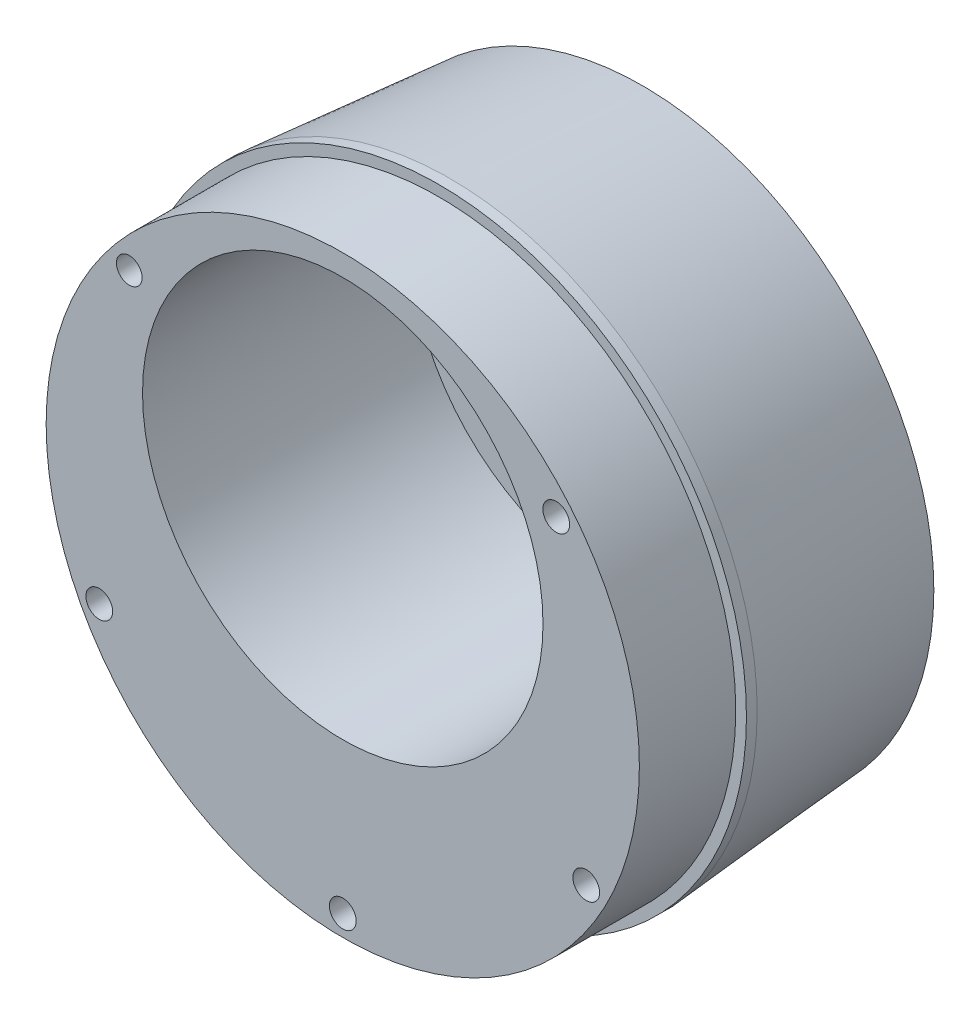
ISO-10303-21;
HEADER;
FILE_DESCRIPTION(('STEP AP214'),'2;1');
FILE_NAME('part.step','',(''),(''),'','','');
FILE_SCHEMA(('AUTOMOTIVE_DESIGN { 1 0 10303 214 1 1 1 1 }'));
ENDSEC;
DATA;
#1=APPLICATION_CONTEXT('core data for automotive mechanical design processes');
#2=APPLICATION_PROTOCOL_DEFINITION('international standard','automotive_design',2000,#1);
#3=PRODUCT_CONTEXT('',#1,'mechanical');
#4=PRODUCT('Part','Part','',(#3));
#5=PRODUCT_RELATED_PRODUCT_CATEGORY('part','',(#4));
#6=PRODUCT_DEFINITION_FORMATION('','',#4);
#7=PRODUCT_DEFINITION_CONTEXT('part definition',#1,'design');
#8=PRODUCT_DEFINITION('design','',#6,#7);
#9=PRODUCT_DEFINITION_SHAPE('','',#8);
#10=(LENGTH_UNIT() NAMED_UNIT(*) SI_UNIT(.MILLI.,.METRE.));
#11=(NAMED_UNIT(*) PLANE_ANGLE_UNIT() SI_UNIT($,.RADIAN.));
#12=(NAMED_UNIT(*) SI_UNIT($,.STERADIAN.) SOLID_ANGLE_UNIT());
#13=UNCERTAINTY_MEASURE_WITH_UNIT(LENGTH_MEASURE(1.E-05),#10,'distance_accuracy_value','');
#14=(GEOMETRIC_REPRESENTATION_CONTEXT(3) GLOBAL_UNCERTAINTY_ASSIGNED_CONTEXT((#13)) GLOBAL_UNIT_ASSIGNED_CONTEXT((#10,
#11,#12)) REPRESENTATION_CONTEXT('',''));
#15=CARTESIAN_POINT('',(0.,0.,0.));
#16=DIRECTION('',(0.,0.,1.));
#17=DIRECTION('',(1.,0.,0.));
#18=AXIS2_PLACEMENT_3D('',#15,#16,#17);
#19=CARTESIAN_POINT('',(15.5,7.,28.));
#20=DIRECTION('',(0.,0.,-1.));
#21=DIRECTION('',(-1.,0.,0.));
#22=AXIS2_PLACEMENT_3D('',#19,#20,#21);
#23=CYLINDRICAL_SURFACE('',#22,1.65);
#24=CARTESIAN_POINT('',(15.5,7.,2.00000000000003));
#25=DIRECTION('',(0.,0.,-1.));
#26=DIRECTION('',(-1.,0.,0.));
#27=AXIS2_PLACEMENT_3D('',#24,#25,#26);
#28=CIRCLE('',#27,1.65);
#29=CARTESIAN_POINT('',(13.85,7.,2.00000000000003));
#30=VERTEX_POINT('',#29);
#31=EDGE_CURVE('E85',#30,#30,#28,.T.);
#32=ORIENTED_EDGE('',*,*,#31,.T.);
#33=EDGE_LOOP('',(#32));
#34=FACE_BOUND('',#33,.T.);
#35=CARTESIAN_POINT('',(15.5,7.,3.));
#36=DIRECTION('',(0.,0.,1.));
#37=DIRECTION('',(1.,0.,0.));
#38=AXIS2_PLACEMENT_3D('',#35,#36,#37);
#39=CIRCLE('',#38,1.65);
#40=CARTESIAN_POINT('',(17.15,7.,3.));
#41=VERTEX_POINT('',#40);
#42=EDGE_CURVE('E99',#41,#41,#39,.T.);
#43=ORIENTED_EDGE('',*,*,#42,.T.);
#44=EDGE_LOOP('',(#43));
#45=FACE_BOUND('',#44,.T.);
#46=ADVANCED_FACE('F38',(#34,#45),#23,.F.);
#47=CARTESIAN_POINT('',(7.74999999999997,-6.42339375865882,28.));
#48=DIRECTION('',(0.,0.,-1.));
#49=DIRECTION('',(-1.,0.,0.));
#50=AXIS2_PLACEMENT_3D('',#47,#48,#49);
#51=CYLINDRICAL_SURFACE('',#50,1.65);
#52=CARTESIAN_POINT('',(7.74999999999997,-6.42339375865882,2.00000000000003));
#53=DIRECTION('',(0.,0.,-1.));
#54=DIRECTION('',(-1.,0.,0.));
#55=AXIS2_PLACEMENT_3D('',#52,#53,#54);
#56=CIRCLE('',#55,1.65);
#57=CARTESIAN_POINT('',(6.09999999999997,-6.42339375865882,2.00000000000003));
#58=VERTEX_POINT('',#57);
#59=EDGE_CURVE('E82',#58,#58,#56,.T.);
#60=ORIENTED_EDGE('',*,*,#59,.T.);
#61=EDGE_LOOP('',(#60));
#62=FACE_BOUND('',#61,.T.);
#63=CARTESIAN_POINT('',(7.74999999999997,-6.42339375865882,3.));
#64=DIRECTION('',(0.,0.,1.));
#65=DIRECTION('',(1.,0.,0.));
#66=AXIS2_PLACEMENT_3D('',#63,#64,#65);
#67=CIRCLE('',#66,1.65);
#68=CARTESIAN_POINT('',(9.39999999999996,-6.42339375865882,3.));
#69=VERTEX_POINT('',#68);
#70=EDGE_CURVE('E102',#69,#69,#67,.T.);
#71=ORIENTED_EDGE('',*,*,#70,.T.);
#72=EDGE_LOOP('',(#71));
#73=FACE_BOUND('',#72,.T.);
#74=ADVANCED_FACE('F242',(#62,#73),#51,.F.);
#75=CARTESIAN_POINT('',(-7.75000000000006,-6.42339375865876,28.));
#76=DIRECTION('',(0.,0.,-1.));
#77=DIRECTION('',(-1.,0.,0.));
#78=AXIS2_PLACEMENT_3D('',#75,#76,#77);
#79=CYLINDRICAL_SURFACE('',#78,1.65);
#80=CARTESIAN_POINT('',(-7.75000000000006,-6.42339375865876,2.00000000000003));
#81=DIRECTION('',(0.,0.,-1.));
#82=DIRECTION('',(-1.,0.,0.));
#83=AXIS2_PLACEMENT_3D('',#80,#81,#82);
#84=CIRCLE('',#83,1.65);
#85=CARTESIAN_POINT('',(-9.40000000000007,-6.42339375865876,2.00000000000003));
#86=VERTEX_POINT('',#85);
#87=EDGE_CURVE('E79',#86,#86,#84,.T.);
#88=ORIENTED_EDGE('',*,*,#87,.T.);
#89=EDGE_LOOP('',(#88));
#90=FACE_BOUND('',#89,.T.);
#91=CARTESIAN_POINT('',(-7.75000000000006,-6.42339375865876,3.));
#92=DIRECTION('',(0.,0.,1.));
#93=DIRECTION('',(1.,0.,0.));
#94=AXIS2_PLACEMENT_3D('',#91,#92,#93);
#95=CIRCLE('',#94,1.65);
#96=CARTESIAN_POINT('',(-6.10000000000006,-6.42339375865876,3.));
#97=VERTEX_POINT('',#96);
#98=EDGE_CURVE('E105',#97,#97,#95,.T.);
#99=ORIENTED_EDGE('',*,*,#98,.T.);
#100=EDGE_LOOP('',(#99));
#101=FACE_BOUND('',#100,.T.);
#102=ADVANCED_FACE('F248',(#90,#101),#79,.F.);
#103=CARTESIAN_POINT('',(-15.5,7.,28.));
#104=DIRECTION('',(0.,0.,-1.));
#105=DIRECTION('',(-1.,0.,0.));
#106=AXIS2_PLACEMENT_3D('',#103,#104,#105);
#107=CYLINDRICAL_SURFACE('',#106,1.64999999999997);
#108=CARTESIAN_POINT('',(-15.5,7.,2.00000000000003));
#109=DIRECTION('',(0.,0.,-1.));
#110=DIRECTION('',(-1.,0.,0.));
#111=AXIS2_PLACEMENT_3D('',#108,#109,#110);
#112=CIRCLE('',#111,1.64999999999997);
#113=CARTESIAN_POINT('',(-17.15,7.,2.00000000000003));
#114=VERTEX_POINT('',#113);
#115=EDGE_CURVE('E76',#114,#114,#112,.T.);
#116=ORIENTED_EDGE('',*,*,#115,.T.);
#117=EDGE_LOOP('',(#116));
#118=FACE_BOUND('',#117,.T.);
#119=CARTESIAN_POINT('',(-15.5,7.,3.));
#120=DIRECTION('',(0.,0.,1.));
#121=DIRECTION('',(1.,0.,0.));
#122=AXIS2_PLACEMENT_3D('',#119,#120,#121);
#123=CIRCLE('',#122,1.64999999999997);
#124=CARTESIAN_POINT('',(-13.85,7.,3.));
#125=VERTEX_POINT('',#124);
#126=EDGE_CURVE('E108',#125,#125,#123,.T.);
#127=ORIENTED_EDGE('',*,*,#126,.T.);
#128=EDGE_LOOP('',(#127));
#129=FACE_BOUND('',#128,.T.);
#130=ADVANCED_FACE('F294',(#118,#129),#107,.F.);
#131=CARTESIAN_POINT('',(-7.74999999999988,20.4233937586589,28.));
#132=DIRECTION('',(0.,0.,-1.));
#133=DIRECTION('',(-1.,0.,0.));
#134=AXIS2_PLACEMENT_3D('',#131,#132,#133);
#135=CYLINDRICAL_SURFACE('',#134,1.65);
#136=CARTESIAN_POINT('',(-7.74999999999988,20.4233937586589,2.00000000000003));
#137=DIRECTION('',(0.,0.,-1.));
#138=DIRECTION('',(-1.,0.,0.));
#139=AXIS2_PLACEMENT_3D('',#136,#137,#138);
#140=CIRCLE('',#139,1.65);
#141=CARTESIAN_POINT('',(-9.39999999999988,20.4233937586589,2.00000000000003));
#142=VERTEX_POINT('',#141);
#143=EDGE_CURVE('E73',#142,#142,#140,.T.);
#144=ORIENTED_EDGE('',*,*,#143,.T.);
#145=EDGE_LOOP('',(#144));
#146=FACE_BOUND('',#145,.T.);
#147=CARTESIAN_POINT('',(-7.74999999999988,20.4233937586589,3.));
#148=DIRECTION('',(0.,0.,1.));
#149=DIRECTION('',(1.,0.,0.));
#150=AXIS2_PLACEMENT_3D('',#147,#148,#149);
#151=CIRCLE('',#150,1.65);
#152=CARTESIAN_POINT('',(-6.09999999999987,20.4233937586589,3.));
#153=VERTEX_POINT('',#152);
#154=EDGE_CURVE('E92',#153,#153,#151,.T.);
#155=ORIENTED_EDGE('',*,*,#154,.T.);
#156=EDGE_LOOP('',(#155));
#157=FACE_BOUND('',#156,.T.);
#158=ADVANCED_FACE('F289',(#146,#157),#135,.F.);
#159=CARTESIAN_POINT('',(7.75000000000016,20.4233937586587,28.));
#160=DIRECTION('',(0.,0.,-1.));
#161=DIRECTION('',(-1.,0.,0.));
#162=AXIS2_PLACEMENT_3D('',#159,#160,#161);
#163=CYLINDRICAL_SURFACE('',#162,1.65);
#164=CARTESIAN_POINT('',(7.75000000000016,20.4233937586587,2.00000000000003));
#165=DIRECTION('',(0.,0.,-1.));
#166=DIRECTION('',(-1.,0.,0.));
#167=AXIS2_PLACEMENT_3D('',#164,#165,#166);
#168=CIRCLE('',#167,1.65);
#169=CARTESIAN_POINT('',(6.10000000000016,20.4233937586587,2.00000000000003));
#170=VERTEX_POINT('',#169);
#171=EDGE_CURVE('E70',#170,#170,#168,.T.);
#172=ORIENTED_EDGE('',*,*,#171,.T.);
#173=EDGE_LOOP('',(#172));
#174=FACE_BOUND('',#173,.T.);
#175=CARTESIAN_POINT('',(7.75000000000016,20.4233937586587,3.));
#176=DIRECTION('',(0.,0.,1.));
#177=DIRECTION('',(1.,0.,0.));
#178=AXIS2_PLACEMENT_3D('',#175,#176,#177);
#179=CIRCLE('',#178,1.65);
#180=CARTESIAN_POINT('',(9.40000000000015,20.4233937586587,3.));
#181=VERTEX_POINT('',#180);
#182=EDGE_CURVE('E89',#181,#181,#179,.T.);
#183=ORIENTED_EDGE('',*,*,#182,.T.);
#184=EDGE_LOOP('',(#183));
#185=FACE_BOUND('',#184,.T.);
#186=ADVANCED_FACE('F221',(#174,#185),#163,.F.);
#187=CARTESIAN_POINT('',(0.,0.,28.));
#188=DIRECTION('',(0.,0.,1.));
#189=DIRECTION('',(1.,0.,0.));
#190=AXIS2_PLACEMENT_3D('',#187,#188,#189);
#191=PLANE('',#190);
#192=CARTESIAN_POINT('',(0.,-25.75,28.));
#193=DIRECTION('',(0.,0.,1.));
#194=DIRECTION('',(1.,0.,0.));
#195=AXIS2_PLACEMENT_3D('',#192,#193,#194);
#196=CIRCLE('',#195,1.25);
#197=CARTESIAN_POINT('',(1.25,-25.75,28.));
#198=VERTEX_POINT('',#197);
#199=EDGE_CURVE('E141',#198,#198,#196,.T.);
#200=ORIENTED_EDGE('',*,*,#199,.F.);
#201=EDGE_LOOP('',(#200));
#202=FACE_BOUND('',#201,.T.);
#203=CARTESIAN_POINT('',(-19.9368843370751,16.2967218461287,28.));
#204=DIRECTION('',(0.,0.,1.));
#205=DIRECTION('',(1.,0.,0.));
#206=AXIS2_PLACEMENT_3D('',#203,#204,#205);
#207=CIRCLE('',#206,1.2);
#208=CARTESIAN_POINT('',(-18.7368843370751,16.2967218461287,28.));
#209=VERTEX_POINT('',#208);
#210=EDGE_CURVE('E142',#209,#209,#207,.T.);
#211=ORIENTED_EDGE('',*,*,#210,.F.);
#212=EDGE_LOOP('',(#211));
#213=FACE_BOUND('',#212,.T.);
#214=CARTESIAN_POINT('',(22.7400198301594,-12.081142252451,28.));
#215=DIRECTION('',(0.,0.,1.));
#216=DIRECTION('',(-1.,0.,0.));
#217=AXIS2_PLACEMENT_3D('',#214,#215,#216);
#218=CIRCLE('',#217,1.25);
#219=CARTESIAN_POINT('',(21.4900198301594,-12.081142252451,28.));
#220=VERTEX_POINT('',#219);
#221=EDGE_CURVE('E149',#220,#220,#218,.T.);
#222=ORIENTED_EDGE('',*,*,#221,.F.);
#223=EDGE_LOOP('',(#222));
#224=FACE_BOUND('',#223,.T.);
#225=CARTESIAN_POINT('',(-22.7400198301594,-12.081142252451,28.));
#226=DIRECTION('',(0.,0.,1.));
#227=DIRECTION('',(1.,0.,0.));
#228=AXIS2_PLACEMENT_3D('',#225,#226,#227);
#229=CIRCLE('',#228,1.25);
#230=CARTESIAN_POINT('',(-21.4900198301594,-12.081142252451,28.));
#231=VERTEX_POINT('',#230);
#232=EDGE_CURVE('E128',#231,#231,#229,.T.);
#233=ORIENTED_EDGE('',*,*,#232,.F.);
#234=EDGE_LOOP('',(#233));
#235=FACE_BOUND('',#234,.T.);
#236=CARTESIAN_POINT('',(19.9368843370751,16.2967218461287,28.));
#237=DIRECTION('',(0.,0.,1.));
#238=DIRECTION('',(-1.,0.,0.));
#239=AXIS2_PLACEMENT_3D('',#236,#237,#238);
#240=CIRCLE('',#239,1.25);
#241=CARTESIAN_POINT('',(18.6868843370751,16.2967218461287,28.));
#242=VERTEX_POINT('',#241);
#243=EDGE_CURVE('E135',#242,#242,#240,.T.);
#244=ORIENTED_EDGE('',*,*,#243,.F.);
#245=EDGE_LOOP('',(#244));
#246=FACE_BOUND('',#245,.T.);
#247=CARTESIAN_POINT('',(0.,7.,28.));
#248=DIRECTION('',(0.,0.,1.));
#249=DIRECTION('',(1.,0.,0.));
#250=AXIS2_PLACEMENT_3D('',#247,#248,#249);
#251=CIRCLE('',#250,18.7);
#252=CARTESIAN_POINT('',(18.7,7.,28.));
#253=VERTEX_POINT('',#252);
#254=EDGE_CURVE('E115',#253,#253,#251,.T.);
#255=ORIENTED_EDGE('',*,*,#254,.F.);
#256=EDGE_LOOP('',(#255));
#257=FACE_BOUND('',#256,.T.);
#258=CARTESIAN_POINT('',(0.,0.,28.));
#259=DIRECTION('',(0.,0.,1.));
#260=DIRECTION('',(1.,0.,0.));
#261=AXIS2_PLACEMENT_3D('',#258,#259,#260);
#262=CIRCLE('',#261,27.7);
#263=CARTESIAN_POINT('',(27.7,0.,28.));
#264=VERTEX_POINT('',#263);
#265=EDGE_CURVE('E122',#264,#264,#262,.T.);
#266=ORIENTED_EDGE('',*,*,#265,.T.);
#267=EDGE_LOOP('',(#266));
#268=FACE_BOUND('',#267,.T.);
#269=ADVANCED_FACE('F218',(#202,#213,#224,#235,#246,#257,#268),#191,.T.);
#270=CARTESIAN_POINT('',(0.,0.,28.));
#271=DIRECTION('',(0.,0.,-1.));
#272=DIRECTION('',(-1.,0.,0.));
#273=AXIS2_PLACEMENT_3D('',#270,#271,#272);
#274=CYLINDRICAL_SURFACE('',#273,28.7);
#275=CARTESIAN_POINT('',(0.,0.,18.0000000000011));
#276=DIRECTION('',(0.,0.,1.));
#277=DIRECTION('',(1.,0.,0.));
#278=AXIS2_PLACEMENT_3D('',#275,#276,#277);
#279=CIRCLE('',#278,28.7);
#280=CARTESIAN_POINT('',(28.7,0.,18.0000000000011));
#281=VERTEX_POINT('',#280);
#282=EDGE_CURVE('E45',#281,#281,#279,.T.);
#283=ORIENTED_EDGE('',*,*,#282,.T.);
#284=EDGE_LOOP('',(#283));
#285=FACE_BOUND('',#284,.T.);
#286=CARTESIAN_POINT('',(0.,0.,19.));
#287=DIRECTION('',(0.,0.,1.));
#288=DIRECTION('',(1.,0.,0.));
#289=AXIS2_PLACEMENT_3D('',#286,#287,#288);
#290=CIRCLE('',#289,28.7);
#291=CARTESIAN_POINT('',(28.7,0.,19.));
#292=VERTEX_POINT('',#291);
#293=EDGE_CURVE('E118',#292,#292,#290,.T.);
#294=ORIENTED_EDGE('',*,*,#293,.F.);
#295=EDGE_LOOP('',(#294));
#296=FACE_BOUND('',#295,.T.);
#297=ADVANCED_FACE('F190',(#285,#296),#274,.T.);
#298=CARTESIAN_POINT('',(0.,0.,28.));
#299=DIRECTION('',(0.,0.,-1.));
#300=DIRECTION('',(-1.,0.,0.));
#301=AXIS2_PLACEMENT_3D('',#298,#299,#300);
#302=CYLINDRICAL_SURFACE('',#301,6.15);
#303=CARTESIAN_POINT('',(0.,0.,0.));
#304=DIRECTION('',(0.,0.,1.));
#305=DIRECTION('',(1.,0.,0.));
#306=AXIS2_PLACEMENT_3D('',#303,#304,#305);
#307=CIRCLE('',#306,6.15);
#308=CARTESIAN_POINT('',(6.15,0.,0.));
#309=VERTEX_POINT('',#308);
#310=EDGE_CURVE('E88',#309,#309,#307,.T.);
#311=ORIENTED_EDGE('',*,*,#310,.F.);
#312=EDGE_LOOP('',(#311));
#313=FACE_BOUND('',#312,.T.);
#314=CARTESIAN_POINT('',(0.,0.,3.));
#315=DIRECTION('',(0.,0.,1.));
#316=DIRECTION('',(1.,0.,0.));
#317=AXIS2_PLACEMENT_3D('',#314,#315,#316);
#318=CIRCLE('',#317,6.15);
#319=CARTESIAN_POINT('',(6.15,0.,3.));
#320=VERTEX_POINT('',#319);
#321=EDGE_CURVE('E96',#320,#320,#318,.T.);
#322=ORIENTED_EDGE('',*,*,#321,.T.);
#323=EDGE_LOOP('',(#322));
#324=FACE_BOUND('',#323,.T.);
#325=ADVANCED_FACE('F182',(#313,#324),#302,.F.);
#326=CARTESIAN_POINT('',(0.,0.,0.));
#327=DIRECTION('',(0.,0.,1.));
#328=DIRECTION('',(1.,0.,0.));
#329=AXIS2_PLACEMENT_3D('',#326,#327,#328);
#330=PLANE('',#329);
#331=CARTESIAN_POINT('',(0.,0.,0.));
#332=DIRECTION('',(0.,0.,1.));
#333=DIRECTION('',(1.,0.,0.));
#334=AXIS2_PLACEMENT_3D('',#331,#332,#333);
#335=CIRCLE('',#334,27.2);
#336=CARTESIAN_POINT('',(27.2,0.,0.));
#337=VERTEX_POINT('',#336);
#338=EDGE_CURVE('E11',#337,#337,#335,.F.);
#339=ORIENTED_EDGE('',*,*,#338,.T.);
#340=EDGE_LOOP('',(#339));
#341=FACE_BOUND('',#340,.T.);
#342=CARTESIAN_POINT('',(15.5,7.,0.));
#343=DIRECTION('',(0.,0.,-1.));
#344=DIRECTION('',(-1.,0.,0.));
#345=AXIS2_PLACEMENT_3D('',#342,#343,#344);
#346=CIRCLE('',#345,3.);
#347=CARTESIAN_POINT('',(12.5,7.,0.));
#348=VERTEX_POINT('',#347);
#349=EDGE_CURVE('E161',#348,#348,#346,.T.);
#350=ORIENTED_EDGE('',*,*,#349,.F.);
#351=EDGE_LOOP('',(#350));
#352=FACE_BOUND('',#351,.T.);
#353=CARTESIAN_POINT('',(7.74999999999997,-6.42339375865882,0.));
#354=DIRECTION('',(0.,0.,-1.));
#355=DIRECTION('',(-1.,0.,0.));
#356=AXIS2_PLACEMENT_3D('',#353,#354,#355);
#357=CIRCLE('',#356,3.);
#358=CARTESIAN_POINT('',(4.74999999999997,-6.42339375865882,0.));
#359=VERTEX_POINT('',#358);
#360=EDGE_CURVE('E164',#359,#359,#357,.T.);
#361=ORIENTED_EDGE('',*,*,#360,.F.);
#362=EDGE_LOOP('',(#361));
#363=FACE_BOUND('',#362,.T.);
#364=CARTESIAN_POINT('',(-7.75000000000006,-6.42339375865876,0.));
#365=DIRECTION('',(0.,0.,-1.));
#366=DIRECTION('',(-1.,0.,0.));
#367=AXIS2_PLACEMENT_3D('',#364,#365,#366);
#368=CIRCLE('',#367,3.);
#369=CARTESIAN_POINT('',(-10.7500000000001,-6.42339375865876,0.));
#370=VERTEX_POINT('',#369);
#371=EDGE_CURVE('E167',#370,#370,#368,.T.);
#372=ORIENTED_EDGE('',*,*,#371,.F.);
#373=EDGE_LOOP('',(#372));
#374=FACE_BOUND('',#373,.T.);
#375=CARTESIAN_POINT('',(-15.5,7.,0.));
#376=DIRECTION('',(0.,0.,-1.));
#377=DIRECTION('',(-1.,0.,0.));
#378=AXIS2_PLACEMENT_3D('',#375,#376,#377);
#379=CIRCLE('',#378,3.);
#380=CARTESIAN_POINT('',(-18.5,7.,0.));
#381=VERTEX_POINT('',#380);
#382=EDGE_CURVE('E170',#381,#381,#379,.T.);
#383=ORIENTED_EDGE('',*,*,#382,.F.);
#384=EDGE_LOOP('',(#383));
#385=FACE_BOUND('',#384,.T.);
#386=CARTESIAN_POINT('',(-7.74999999999988,20.4233937586589,0.));
#387=DIRECTION('',(0.,0.,-1.));
#388=DIRECTION('',(-1.,0.,0.));
#389=AXIS2_PLACEMENT_3D('',#386,#387,#388);
#390=CIRCLE('',#389,3.);
#391=CARTESIAN_POINT('',(-10.7499999999999,20.4233937586589,0.));
#392=VERTEX_POINT('',#391);
#393=EDGE_CURVE('E160',#392,#392,#390,.T.);
#394=ORIENTED_EDGE('',*,*,#393,.F.);
#395=EDGE_LOOP('',(#394));
#396=FACE_BOUND('',#395,.T.);
#397=CARTESIAN_POINT('',(7.75000000000016,20.4233937586587,0.));
#398=DIRECTION('',(0.,0.,-1.));
#399=DIRECTION('',(-1.,0.,0.));
#400=AXIS2_PLACEMENT_3D('',#397,#398,#399);
#401=CIRCLE('',#400,3.);
#402=CARTESIAN_POINT('',(4.75000000000016,20.4233937586587,0.));
#403=VERTEX_POINT('',#402);
#404=EDGE_CURVE('E146',#403,#403,#401,.T.);
#405=ORIENTED_EDGE('',*,*,#404,.F.);
#406=EDGE_LOOP('',(#405));
#407=FACE_BOUND('',#406,.T.);
#408=ORIENTED_EDGE('',*,*,#310,.T.);
#409=EDGE_LOOP('',(#408));
#410=FACE_BOUND('',#409,.T.);
#411=ADVANCED_FACE('F178',(#341,#352,#363,#374,#385,#396,#407,#410),#330,.F.);
#412=CARTESIAN_POINT('',(0.,7.,-52.8915872327537));
#413=DIRECTION('',(0.,0.,1.));
#414=DIRECTION('',(1.,0.,0.));
#415=AXIS2_PLACEMENT_3D('',#412,#413,#414);
#416=CYLINDRICAL_SURFACE('',#415,18.7);
#417=CARTESIAN_POINT('',(0.,7.,3.));
#418=DIRECTION('',(0.,0.,1.));
#419=DIRECTION('',(1.,0.,0.));
#420=AXIS2_PLACEMENT_3D('',#417,#418,#419);
#421=CIRCLE('',#420,18.7);
#422=CARTESIAN_POINT('',(18.7,7.,3.));
#423=VERTEX_POINT('',#422);
#424=EDGE_CURVE('E93',#423,#423,#421,.F.);
#425=ORIENTED_EDGE('',*,*,#424,.T.);
#426=EDGE_LOOP('',(#425));
#427=FACE_BOUND('',#426,.T.);
#428=ORIENTED_EDGE('',*,*,#254,.T.);
#429=EDGE_LOOP('',(#428));
#430=FACE_BOUND('',#429,.T.);
#431=ADVANCED_FACE('F181',(#427,#430),#416,.F.);
#432=CARTESIAN_POINT('',(0.,0.,3.));
#433=DIRECTION('',(0.,0.,1.));
#434=DIRECTION('',(1.,0.,0.));
#435=AXIS2_PLACEMENT_3D('',#432,#433,#434);
#436=PLANE('',#435);
#437=ORIENTED_EDGE('',*,*,#321,.F.);
#438=EDGE_LOOP('',(#437));
#439=FACE_BOUND('',#438,.T.);
#440=ORIENTED_EDGE('',*,*,#42,.F.);
#441=EDGE_LOOP('',(#440));
#442=FACE_BOUND('',#441,.T.);
#443=ORIENTED_EDGE('',*,*,#70,.F.);
#444=EDGE_LOOP('',(#443));
#445=FACE_BOUND('',#444,.T.);
#446=ORIENTED_EDGE('',*,*,#98,.F.);
#447=EDGE_LOOP('',(#446));
#448=FACE_BOUND('',#447,.T.);
#449=ORIENTED_EDGE('',*,*,#126,.F.);
#450=EDGE_LOOP('',(#449));
#451=FACE_BOUND('',#450,.T.);
#452=ORIENTED_EDGE('',*,*,#154,.F.);
#453=EDGE_LOOP('',(#452));
#454=FACE_BOUND('',#453,.T.);
#455=ORIENTED_EDGE('',*,*,#182,.F.);
#456=EDGE_LOOP('',(#455));
#457=FACE_BOUND('',#456,.T.);
#458=ORIENTED_EDGE('',*,*,#424,.F.);
#459=EDGE_LOOP('',(#458));
#460=FACE_BOUND('',#459,.T.);
#461=ADVANCED_FACE('F194',(#439,#442,#445,#448,#451,#454,#457,#460),#436,.T.);
#462=CARTESIAN_POINT('',(0.,0.,19.));
#463=DIRECTION('',(0.,0.,1.));
#464=DIRECTION('',(1.,0.,0.));
#465=AXIS2_PLACEMENT_3D('',#462,#463,#464);
#466=PLANE('',#465);
#467=CARTESIAN_POINT('',(0.,0.,19.));
#468=DIRECTION('',(0.,0.,1.));
#469=DIRECTION('',(1.,0.,0.));
#470=AXIS2_PLACEMENT_3D('',#467,#468,#469);
#471=CIRCLE('',#470,27.7);
#472=CARTESIAN_POINT('',(27.7,0.,19.));
#473=VERTEX_POINT('',#472);
#474=EDGE_CURVE('E121',#473,#473,#471,.T.);
#475=ORIENTED_EDGE('',*,*,#474,.F.);
#476=EDGE_LOOP('',(#475));
#477=FACE_BOUND('',#476,.T.);
#478=ORIENTED_EDGE('',*,*,#293,.T.);
#479=EDGE_LOOP('',(#478));
#480=FACE_BOUND('',#479,.T.);
#481=ADVANCED_FACE('F197',(#477,#480),#466,.T.);
#482=CARTESIAN_POINT('',(0.,0.,19.));
#483=DIRECTION('',(0.,0.,1.));
#484=DIRECTION('',(1.,0.,0.));
#485=AXIS2_PLACEMENT_3D('',#482,#483,#484);
#486=CYLINDRICAL_SURFACE('',#485,27.7);
#487=ORIENTED_EDGE('',*,*,#474,.T.);
#488=EDGE_LOOP('',(#487));
#489=FACE_BOUND('',#488,.T.);
#490=ORIENTED_EDGE('',*,*,#265,.F.);
#491=EDGE_LOOP('',(#490));
#492=FACE_BOUND('',#491,.T.);
#493=ADVANCED_FACE('F226',(#489,#492),#486,.T.);
#494=CARTESIAN_POINT('',(19.9368843370751,16.2967218461287,18.));
#495=DIRECTION('',(0.,0.,1.));
#496=DIRECTION('',(1.,0.,0.));
#497=AXIS2_PLACEMENT_3D('',#494,#495,#496);
#498=CYLINDRICAL_SURFACE('',#497,1.25);
#499=CARTESIAN_POINT('',(19.9368843370751,16.2967218461287,18.));
#500=DIRECTION('',(0.,0.,1.));
#501=DIRECTION('',(-1.,0.,0.));
#502=AXIS2_PLACEMENT_3D('',#499,#500,#501);
#503=CIRCLE('',#502,1.25);
#504=CARTESIAN_POINT('',(18.6868843370751,16.2967218461287,18.));
#505=VERTEX_POINT('',#504);
#506=EDGE_CURVE('E138',#505,#505,#503,.T.);
#507=ORIENTED_EDGE('',*,*,#506,.F.);
#508=EDGE_LOOP('',(#507));
#509=FACE_BOUND('',#508,.T.);
#510=ORIENTED_EDGE('',*,*,#243,.T.);
#511=EDGE_LOOP('',(#510));
#512=FACE_BOUND('',#511,.T.);
#513=ADVANCED_FACE('F228',(#509,#512),#498,.F.);
#514=CARTESIAN_POINT('',(19.9368843370751,16.2967218461287,18.));
#515=DIRECTION('',(0.,0.,-1.));
#516=DIRECTION('',(-1.,0.,0.));
#517=AXIS2_PLACEMENT_3D('',#514,#515,#516);
#518=PLANE('',#517);
#519=ORIENTED_EDGE('',*,*,#506,.T.);
#520=EDGE_LOOP('',(#519));
#521=FACE_BOUND('',#520,.T.);
#522=ADVANCED_FACE('F235',(#521),#518,.F.);
#523=CARTESIAN_POINT('',(-22.7400198301594,-12.081142252451,18.));
#524=DIRECTION('',(0.,0.,1.));
#525=DIRECTION('',(1.,0.,0.));
#526=AXIS2_PLACEMENT_3D('',#523,#524,#525);
#527=CYLINDRICAL_SURFACE('',#526,1.25);
#528=CARTESIAN_POINT('',(-22.7400198301594,-12.081142252451,18.));
#529=DIRECTION('',(0.,0.,1.));
#530=DIRECTION('',(1.,0.,0.));
#531=AXIS2_PLACEMENT_3D('',#528,#529,#530);
#532=CIRCLE('',#531,1.25);
#533=CARTESIAN_POINT('',(-21.4900198301594,-12.081142252451,18.));
#534=VERTEX_POINT('',#533);
#535=EDGE_CURVE('E131',#534,#534,#532,.T.);
#536=ORIENTED_EDGE('',*,*,#535,.F.);
#537=EDGE_LOOP('',(#536));
#538=FACE_BOUND('',#537,.T.);
#539=ORIENTED_EDGE('',*,*,#232,.T.);
#540=EDGE_LOOP('',(#539));
#541=FACE_BOUND('',#540,.T.);
#542=ADVANCED_FACE('F477',(#538,#541),#527,.F.);
#543=CARTESIAN_POINT('',(-22.7400198301594,-12.081142252451,18.));
#544=DIRECTION('',(0.,0.,1.));
#545=DIRECTION('',(1.,0.,0.));
#546=AXIS2_PLACEMENT_3D('',#543,#544,#545);
#547=PLANE('',#546);
#548=ORIENTED_EDGE('',*,*,#535,.T.);
#549=EDGE_LOOP('',(#548));
#550=FACE_BOUND('',#549,.T.);
#551=ADVANCED_FACE('F487',(#550),#547,.T.);
#552=CARTESIAN_POINT('',(22.7400198301594,-12.081142252451,18.));
#553=DIRECTION('',(0.,0.,1.));
#554=DIRECTION('',(1.,0.,0.));
#555=AXIS2_PLACEMENT_3D('',#552,#553,#554);
#556=CYLINDRICAL_SURFACE('',#555,1.25);
#557=CARTESIAN_POINT('',(22.7400198301594,-12.081142252451,18.));
#558=DIRECTION('',(0.,0.,1.));
#559=DIRECTION('',(-1.,0.,0.));
#560=AXIS2_PLACEMENT_3D('',#557,#558,#559);
#561=CIRCLE('',#560,1.25);
#562=CARTESIAN_POINT('',(21.4900198301594,-12.081142252451,18.));
#563=VERTEX_POINT('',#562);
#564=EDGE_CURVE('E132',#563,#563,#561,.T.);
#565=ORIENTED_EDGE('',*,*,#564,.F.);
#566=EDGE_LOOP('',(#565));
#567=FACE_BOUND('',#566,.T.);
#568=ORIENTED_EDGE('',*,*,#221,.T.);
#569=EDGE_LOOP('',(#568));
#570=FACE_BOUND('',#569,.T.);
#571=ADVANCED_FACE('F496',(#567,#570),#556,.F.);
#572=CARTESIAN_POINT('',(22.7400198301594,-12.081142252451,18.));
#573=DIRECTION('',(0.,0.,-1.));
#574=DIRECTION('',(-1.,0.,0.));
#575=AXIS2_PLACEMENT_3D('',#572,#573,#574);
#576=PLANE('',#575);
#577=ORIENTED_EDGE('',*,*,#564,.T.);
#578=EDGE_LOOP('',(#577));
#579=FACE_BOUND('',#578,.T.);
#580=ADVANCED_FACE('F506',(#579),#576,.F.);
#581=CARTESIAN_POINT('',(-19.9368843370751,16.2967218461287,18.));
#582=DIRECTION('',(0.,0.,1.));
#583=DIRECTION('',(1.,0.,0.));
#584=AXIS2_PLACEMENT_3D('',#581,#582,#583);
#585=CYLINDRICAL_SURFACE('',#584,1.2);
#586=CARTESIAN_POINT('',(-19.9368843370751,16.2967218461287,18.));
#587=DIRECTION('',(0.,0.,1.));
#588=DIRECTION('',(1.,0.,0.));
#589=AXIS2_PLACEMENT_3D('',#586,#587,#588);
#590=CIRCLE('',#589,1.2);
#591=CARTESIAN_POINT('',(-18.7368843370751,16.2967218461287,18.));
#592=VERTEX_POINT('',#591);
#593=EDGE_CURVE('E145',#592,#592,#590,.T.);
#594=ORIENTED_EDGE('',*,*,#593,.F.);
#595=EDGE_LOOP('',(#594));
#596=FACE_BOUND('',#595,.T.);
#597=ORIENTED_EDGE('',*,*,#210,.T.);
#598=EDGE_LOOP('',(#597));
#599=FACE_BOUND('',#598,.T.);
#600=ADVANCED_FACE('F516',(#596,#599),#585,.F.);
#601=CARTESIAN_POINT('',(-19.9368843370751,16.2967218461287,18.));
#602=DIRECTION('',(0.,0.,1.));
#603=DIRECTION('',(1.,0.,0.));
#604=AXIS2_PLACEMENT_3D('',#601,#602,#603);
#605=PLANE('',#604);
#606=ORIENTED_EDGE('',*,*,#593,.T.);
#607=EDGE_LOOP('',(#606));
#608=FACE_BOUND('',#607,.T.);
#609=ADVANCED_FACE('F526',(#608),#605,.T.);
#610=CARTESIAN_POINT('',(0.,-25.75,18.));
#611=DIRECTION('',(0.,0.,1.));
#612=DIRECTION('',(1.,0.,0.));
#613=AXIS2_PLACEMENT_3D('',#610,#611,#612);
#614=CYLINDRICAL_SURFACE('',#613,1.25);
#615=CARTESIAN_POINT('',(0.,-25.75,18.));
#616=DIRECTION('',(0.,0.,1.));
#617=DIRECTION('',(1.,0.,0.));
#618=AXIS2_PLACEMENT_3D('',#615,#616,#617);
#619=CIRCLE('',#618,1.25);
#620=CARTESIAN_POINT('',(1.25,-25.75,18.));
#621=VERTEX_POINT('',#620);
#622=EDGE_CURVE('E125',#621,#621,#619,.T.);
#623=ORIENTED_EDGE('',*,*,#622,.F.);
#624=EDGE_LOOP('',(#623));
#625=FACE_BOUND('',#624,.T.);
#626=ORIENTED_EDGE('',*,*,#199,.T.);
#627=EDGE_LOOP('',(#626));
#628=FACE_BOUND('',#627,.T.);
#629=ADVANCED_FACE('F536',(#625,#628),#614,.F.);
#630=CARTESIAN_POINT('',(0.,-25.75,18.));
#631=DIRECTION('',(0.,0.,1.));
#632=DIRECTION('',(1.,0.,0.));
#633=AXIS2_PLACEMENT_3D('',#630,#631,#632);
#634=PLANE('',#633);
#635=ORIENTED_EDGE('',*,*,#622,.T.);
#636=EDGE_LOOP('',(#635));
#637=FACE_BOUND('',#636,.T.);
#638=ADVANCED_FACE('F332',(#637),#634,.T.);
#639=CARTESIAN_POINT('',(7.75000000000016,20.4233937586587,0.5));
#640=DIRECTION('',(0.,0.,-1.));
#641=DIRECTION('',(-1.,0.,0.));
#642=AXIS2_PLACEMENT_3D('',#639,#640,#641);
#643=CYLINDRICAL_SURFACE('',#642,3.);
#644=CARTESIAN_POINT('',(7.75000000000016,20.4233937586587,0.650000000000012));
#645=DIRECTION('',(0.,0.,-1.));
#646=DIRECTION('',(-1.,0.,0.));
#647=AXIS2_PLACEMENT_3D('',#644,#645,#646);
#648=CIRCLE('',#647,3.);
#649=CARTESIAN_POINT('',(4.75000000000016,20.4233937586587,0.650000000000012));
#650=VERTEX_POINT('',#649);
#651=EDGE_CURVE('E49',#650,#650,#648,.F.);
#652=ORIENTED_EDGE('',*,*,#651,.T.);
#653=EDGE_LOOP('',(#652));
#654=FACE_BOUND('',#653,.T.);
#655=ORIENTED_EDGE('',*,*,#404,.T.);
#656=EDGE_LOOP('',(#655));
#657=FACE_BOUND('',#656,.T.);
#658=ADVANCED_FACE('F327',(#654,#657),#643,.F.);
#659=CARTESIAN_POINT('',(-7.74999999999988,20.4233937586589,0.5));
#660=DIRECTION('',(0.,0.,-1.));
#661=DIRECTION('',(-1.,0.,0.));
#662=AXIS2_PLACEMENT_3D('',#659,#660,#661);
#663=CYLINDRICAL_SURFACE('',#662,3.);
#664=CARTESIAN_POINT('',(-7.74999999999988,20.4233937586589,0.650000000000014));
#665=DIRECTION('',(0.,0.,-1.));
#666=DIRECTION('',(-1.,0.,0.));
#667=AXIS2_PLACEMENT_3D('',#664,#665,#666);
#668=CIRCLE('',#667,3.);
#669=CARTESIAN_POINT('',(-10.7499999999999,20.4233937586589,0.650000000000014));
#670=VERTEX_POINT('',#669);
#671=EDGE_CURVE('E53',#670,#670,#668,.F.);
#672=ORIENTED_EDGE('',*,*,#671,.T.);
#673=EDGE_LOOP('',(#672));
#674=FACE_BOUND('',#673,.T.);
#675=ORIENTED_EDGE('',*,*,#393,.T.);
#676=EDGE_LOOP('',(#675));
#677=FACE_BOUND('',#676,.T.);
#678=ADVANCED_FACE('F176',(#674,#677),#663,.F.);
#679=CARTESIAN_POINT('',(-15.5,7.,0.5));
#680=DIRECTION('',(0.,0.,-1.));
#681=DIRECTION('',(-1.,0.,0.));
#682=AXIS2_PLACEMENT_3D('',#679,#680,#681);
#683=CYLINDRICAL_SURFACE('',#682,3.);
#684=CARTESIAN_POINT('',(-15.5,7.,0.64999999999998));
#685=DIRECTION('',(0.,0.,-1.));
#686=DIRECTION('',(-1.,0.,0.));
#687=AXIS2_PLACEMENT_3D('',#684,#685,#686);
#688=CIRCLE('',#687,3.);
#689=CARTESIAN_POINT('',(-18.5,7.,0.64999999999998));
#690=VERTEX_POINT('',#689);
#691=EDGE_CURVE('E58',#690,#690,#688,.F.);
#692=ORIENTED_EDGE('',*,*,#691,.T.);
#693=EDGE_LOOP('',(#692));
#694=FACE_BOUND('',#693,.T.);
#695=ORIENTED_EDGE('',*,*,#382,.T.);
#696=EDGE_LOOP('',(#695));
#697=FACE_BOUND('',#696,.T.);
#698=ADVANCED_FACE('F344',(#694,#697),#683,.F.);
#699=CARTESIAN_POINT('',(-7.75000000000006,-6.42339375865876,0.5));
#700=DIRECTION('',(0.,0.,-1.));
#701=DIRECTION('',(-1.,0.,0.));
#702=AXIS2_PLACEMENT_3D('',#699,#700,#701);
#703=CYLINDRICAL_SURFACE('',#702,3.);
#704=CARTESIAN_POINT('',(-7.75000000000006,-6.42339375865876,0.650000000000015));
#705=DIRECTION('',(0.,0.,-1.));
#706=DIRECTION('',(-1.,0.,0.));
#707=AXIS2_PLACEMENT_3D('',#704,#705,#706);
#708=CIRCLE('',#707,3.);
#709=CARTESIAN_POINT('',(-10.7500000000001,-6.42339375865876,0.650000000000015));
#710=VERTEX_POINT('',#709);
#711=EDGE_CURVE('E61',#710,#710,#708,.F.);
#712=ORIENTED_EDGE('',*,*,#711,.T.);
#713=EDGE_LOOP('',(#712));
#714=FACE_BOUND('',#713,.T.);
#715=ORIENTED_EDGE('',*,*,#371,.T.);
#716=EDGE_LOOP('',(#715));
#717=FACE_BOUND('',#716,.T.);
#718=ADVANCED_FACE('F354',(#714,#717),#703,.F.);
#719=CARTESIAN_POINT('',(7.74999999999997,-6.42339375865882,0.5));
#720=DIRECTION('',(0.,0.,-1.));
#721=DIRECTION('',(-1.,0.,0.));
#722=AXIS2_PLACEMENT_3D('',#719,#720,#721);
#723=CYLINDRICAL_SURFACE('',#722,3.);
#724=CARTESIAN_POINT('',(7.74999999999997,-6.42339375865882,0.650000000000012));
#725=DIRECTION('',(0.,0.,-1.));
#726=DIRECTION('',(-1.,0.,0.));
#727=AXIS2_PLACEMENT_3D('',#724,#725,#726);
#728=CIRCLE('',#727,3.);
#729=CARTESIAN_POINT('',(4.74999999999997,-6.42339375865882,0.650000000000012));
#730=VERTEX_POINT('',#729);
#731=EDGE_CURVE('E64',#730,#730,#728,.F.);
#732=ORIENTED_EDGE('',*,*,#731,.T.);
#733=EDGE_LOOP('',(#732));
#734=FACE_BOUND('',#733,.T.);
#735=ORIENTED_EDGE('',*,*,#360,.T.);
#736=EDGE_LOOP('',(#735));
#737=FACE_BOUND('',#736,.T.);
#738=ADVANCED_FACE('F364',(#734,#737),#723,.F.);
#739=CARTESIAN_POINT('',(15.5,7.,0.5));
#740=DIRECTION('',(0.,0.,-1.));
#741=DIRECTION('',(-1.,0.,0.));
#742=AXIS2_PLACEMENT_3D('',#739,#740,#741);
#743=CYLINDRICAL_SURFACE('',#742,3.);
#744=CARTESIAN_POINT('',(15.5,7.,0.650000000000017));
#745=DIRECTION('',(0.,0.,-1.));
#746=DIRECTION('',(-1.,0.,0.));
#747=AXIS2_PLACEMENT_3D('',#744,#745,#746);
#748=CIRCLE('',#747,3.);
#749=CARTESIAN_POINT('',(12.5,7.,0.650000000000017));
#750=VERTEX_POINT('',#749);
#751=EDGE_CURVE('E67',#750,#750,#748,.F.);
#752=ORIENTED_EDGE('',*,*,#751,.T.);
#753=EDGE_LOOP('',(#752));
#754=FACE_BOUND('',#753,.T.);
#755=ORIENTED_EDGE('',*,*,#349,.T.);
#756=EDGE_LOOP('',(#755));
#757=FACE_BOUND('',#756,.T.);
#758=ADVANCED_FACE('F260',(#754,#757),#743,.F.);
#759=CARTESIAN_POINT('',(15.5,7.,2.00000000000003));
#760=DIRECTION('',(0.,0.,-1.));
#761=DIRECTION('',(-1.,0.,0.));
#762=AXIS2_PLACEMENT_3D('',#759,#760,#761);
#763=CONICAL_SURFACE('',#762,1.65,0.785398163397444);
#764=ORIENTED_EDGE('',*,*,#751,.F.);
#765=EDGE_LOOP('',(#764));
#766=FACE_BOUND('',#765,.T.);
#767=ORIENTED_EDGE('',*,*,#31,.F.);
#768=EDGE_LOOP('',(#767));
#769=FACE_BOUND('',#768,.T.);
#770=ADVANCED_FACE('F256',(#766,#769),#763,.F.);
#771=CARTESIAN_POINT('',(7.74999999999997,-6.42339375865882,2.00000000000003));
#772=DIRECTION('',(0.,0.,-1.));
#773=DIRECTION('',(-1.,0.,0.));
#774=AXIS2_PLACEMENT_3D('',#771,#772,#773);
#775=CONICAL_SURFACE('',#774,1.65,0.785398163397443);
#776=ORIENTED_EDGE('',*,*,#731,.F.);
#777=EDGE_LOOP('',(#776));
#778=FACE_BOUND('',#777,.T.);
#779=ORIENTED_EDGE('',*,*,#59,.F.);
#780=EDGE_LOOP('',(#779));
#781=FACE_BOUND('',#780,.T.);
#782=ADVANCED_FACE('F259',(#778,#781),#775,.F.);
#783=CARTESIAN_POINT('',(-7.75000000000006,-6.42339375865876,2.00000000000003));
#784=DIRECTION('',(0.,0.,-1.));
#785=DIRECTION('',(-1.,0.,0.));
#786=AXIS2_PLACEMENT_3D('',#783,#784,#785);
#787=CONICAL_SURFACE('',#786,1.65,0.785398163397443);
#788=ORIENTED_EDGE('',*,*,#711,.F.);
#789=EDGE_LOOP('',(#788));
#790=FACE_BOUND('',#789,.T.);
#791=ORIENTED_EDGE('',*,*,#87,.F.);
#792=EDGE_LOOP('',(#791));
#793=FACE_BOUND('',#792,.T.);
#794=ADVANCED_FACE('F264',(#790,#793),#787,.F.);
#795=CARTESIAN_POINT('',(-15.5,7.,2.00000000000003));
#796=DIRECTION('',(0.,0.,-1.));
#797=DIRECTION('',(-1.,0.,0.));
#798=AXIS2_PLACEMENT_3D('',#795,#796,#797);
#799=CONICAL_SURFACE('',#798,1.64999999999997,0.785398163397443);
#800=ORIENTED_EDGE('',*,*,#691,.F.);
#801=EDGE_LOOP('',(#800));
#802=FACE_BOUND('',#801,.T.);
#803=ORIENTED_EDGE('',*,*,#115,.F.);
#804=EDGE_LOOP('',(#803));
#805=FACE_BOUND('',#804,.T.);
#806=ADVANCED_FACE('F268',(#802,#805),#799,.F.);
#807=CARTESIAN_POINT('',(-7.74999999999988,20.4233937586589,2.00000000000003));
#808=DIRECTION('',(0.,0.,-1.));
#809=DIRECTION('',(-1.,0.,0.));
#810=AXIS2_PLACEMENT_3D('',#807,#808,#809);
#811=CONICAL_SURFACE('',#810,1.65,0.785398163397443);
#812=ORIENTED_EDGE('',*,*,#671,.F.);
#813=EDGE_LOOP('',(#812));
#814=FACE_BOUND('',#813,.T.);
#815=ORIENTED_EDGE('',*,*,#143,.F.);
#816=EDGE_LOOP('',(#815));
#817=FACE_BOUND('',#816,.T.);
#818=ADVANCED_FACE('F272',(#814,#817),#811,.F.);
#819=CARTESIAN_POINT('',(7.75000000000016,20.4233937586587,2.00000000000003));
#820=DIRECTION('',(0.,0.,-1.));
#821=DIRECTION('',(-1.,0.,0.));
#822=AXIS2_PLACEMENT_3D('',#819,#820,#821);
#823=CONICAL_SURFACE('',#822,1.65,0.785398163397444);
#824=ORIENTED_EDGE('',*,*,#651,.F.);
#825=EDGE_LOOP('',(#824));
#826=FACE_BOUND('',#825,.T.);
#827=ORIENTED_EDGE('',*,*,#171,.F.);
#828=EDGE_LOOP('',(#827));
#829=FACE_BOUND('',#828,.T.);
#830=ADVANCED_FACE('F275',(#826,#829),#823,.F.);
#831=CARTESIAN_POINT('',(0.,0.,18.0000000000011));
#832=DIRECTION('',(0.,0.,1.));
#833=DIRECTION('',(1.,0.,0.));
#834=AXIS2_PLACEMENT_3D('',#831,#832,#833);
#835=CONICAL_SURFACE('',#834,28.7,0.0831412318884382);
#836=ORIENTED_EDGE('',*,*,#338,.F.);
#837=EDGE_LOOP('',(#836));
#838=FACE_BOUND('',#837,.T.);
#839=ORIENTED_EDGE('',*,*,#282,.F.);
#840=EDGE_LOOP('',(#839));
#841=FACE_BOUND('',#840,.T.);
#842=ADVANCED_FACE('F40',(#838,#841),#835,.T.);
#843=CLOSED_SHELL('',(#46,#74,#102,#130,#158,#186,#269,#297,#325,#411,#431,#461,#481,#493,#513,
#522,#542,#551,#571,#580,#600,#609,#629,#638,#658,#678,#698,#718,#738,#758,#770,#782,#794,#806,
#818,#830,#842));
#844=MANIFOLD_SOLID_BREP('B2',#843);
#845=ADVANCED_BREP_SHAPE_REPRESENTATION('',(#18,#844),#14);
#846=SHAPE_DEFINITION_REPRESENTATION(#9,#845);
ENDSEC;
END-ISO-10303-21;
